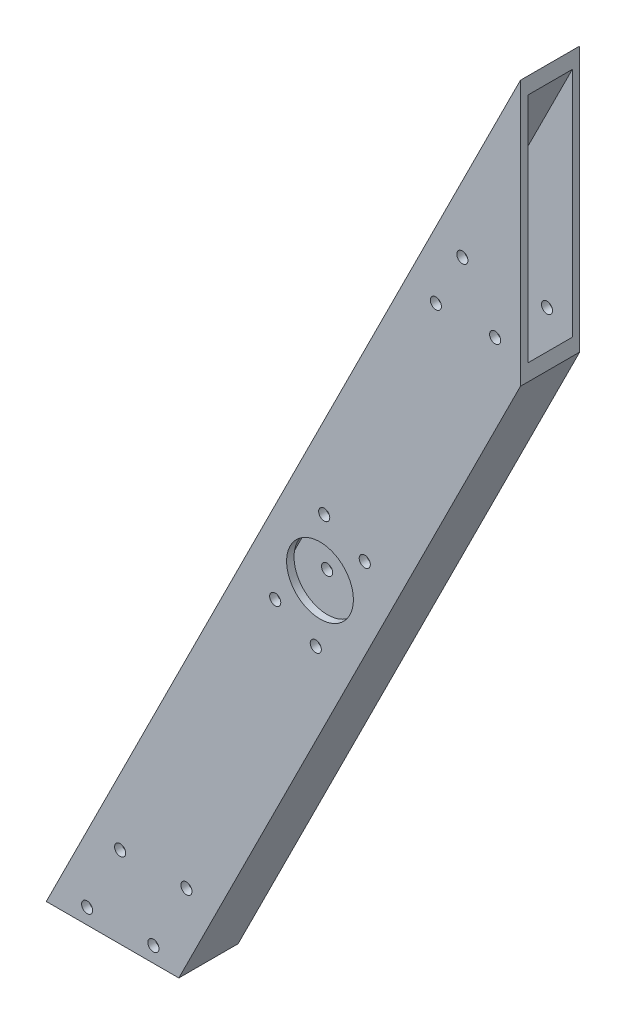
ISO-10303-21;
HEADER;
FILE_DESCRIPTION(('STEP AP214'),'2;1');
FILE_NAME('part.step','',(''),(''),'','','');
FILE_SCHEMA(('AUTOMOTIVE_DESIGN { 1 0 10303 214 1 1 1 1 }'));
ENDSEC;
DATA;
#1=APPLICATION_CONTEXT('core data for automotive mechanical design processes');
#2=APPLICATION_PROTOCOL_DEFINITION('international standard','automotive_design',2000,#1);
#3=PRODUCT_CONTEXT('',#1,'mechanical');
#4=PRODUCT('Part','Part','',(#3));
#5=PRODUCT_RELATED_PRODUCT_CATEGORY('part','',(#4));
#6=PRODUCT_DEFINITION_FORMATION('','',#4);
#7=PRODUCT_DEFINITION_CONTEXT('part definition',#1,'design');
#8=PRODUCT_DEFINITION('design','',#6,#7);
#9=PRODUCT_DEFINITION_SHAPE('','',#8);
#10=(LENGTH_UNIT() NAMED_UNIT(*) SI_UNIT(.MILLI.,.METRE.));
#11=(NAMED_UNIT(*) PLANE_ANGLE_UNIT() SI_UNIT($,.RADIAN.));
#12=(NAMED_UNIT(*) SI_UNIT($,.STERADIAN.) SOLID_ANGLE_UNIT());
#13=UNCERTAINTY_MEASURE_WITH_UNIT(LENGTH_MEASURE(1.E-05),#10,'distance_accuracy_value','');
#14=(GEOMETRIC_REPRESENTATION_CONTEXT(3) GLOBAL_UNCERTAINTY_ASSIGNED_CONTEXT((#13)) GLOBAL_UNIT_ASSIGNED_CONTEXT((#10,
#11,#12)) REPRESENTATION_CONTEXT('',''));
#15=CARTESIAN_POINT('',(0.,0.,0.));
#16=DIRECTION('',(0.,0.,1.));
#17=DIRECTION('',(1.,0.,0.));
#18=AXIS2_PLACEMENT_3D('',#15,#16,#17);
#19=CARTESIAN_POINT('',(56.7961266284947,0.,25.4));
#20=DIRECTION('',(0.,1.,0.));
#21=DIRECTION('',(-1.,0.,0.));
#22=AXIS2_PLACEMENT_3D('',#19,#20,#21);
#23=PLANE('',#22);
#24=DIRECTION('',(1.,0.,0.));
#25=VECTOR('',#24,1.);
#26=CARTESIAN_POINT('',(56.7961266284947,0.,0.));
#27=LINE('',#26,#25);
#28=CARTESIAN_POINT('',(0.,0.,0.));
#29=VERTEX_POINT('',#28);
#30=CARTESIAN_POINT('',(56.7961266284947,0.,0.));
#31=VERTEX_POINT('',#30);
#32=EDGE_CURVE('E133',#29,#31,#27,.T.);
#33=ORIENTED_EDGE('',*,*,#32,.T.);
#34=DIRECTION('',(0.,0.,-1.));
#35=VECTOR('',#34,1.);
#36=CARTESIAN_POINT('',(56.7961266284947,0.,25.4));
#37=LINE('',#36,#35);
#38=CARTESIAN_POINT('',(56.7961266284947,0.,25.4));
#39=VERTEX_POINT('',#38);
#40=EDGE_CURVE('E11',#39,#31,#37,.T.);
#41=ORIENTED_EDGE('',*,*,#40,.F.);
#42=DIRECTION('',(1.,0.,0.));
#43=VECTOR('',#42,1.);
#44=CARTESIAN_POINT('',(56.7961266284947,0.,25.4));
#45=LINE('',#44,#43);
#46=CARTESIAN_POINT('',(0.,0.,25.4));
#47=VERTEX_POINT('',#46);
#48=EDGE_CURVE('E139',#47,#39,#45,.T.);
#49=ORIENTED_EDGE('',*,*,#48,.F.);
#50=DIRECTION('',(0.,0.,-1.));
#51=VECTOR('',#50,1.);
#52=CARTESIAN_POINT('',(0.,0.,25.4));
#53=LINE('',#52,#51);
#54=EDGE_CURVE('E149',#47,#29,#53,.T.);
#55=ORIENTED_EDGE('',*,*,#54,.T.);
#56=EDGE_LOOP('',(#33,#41,#49,#55));
#57=FACE_BOUND('',#56,.T.);
#58=DIRECTION('',(1.,0.,0.));
#59=VECTOR('',#58,1.);
#60=CARTESIAN_POINT('',(56.7961266284947,0.,3.175));
#61=LINE('',#60,#59);
#62=CARTESIAN_POINT('',(3.54975791428092,0.,3.175));
#63=VERTEX_POINT('',#62);
#64=CARTESIAN_POINT('',(53.2463687142137,0.,3.175));
#65=VERTEX_POINT('',#64);
#66=EDGE_CURVE('E109',#63,#65,#61,.T.);
#67=ORIENTED_EDGE('',*,*,#66,.F.);
#68=DIRECTION('',(0.,0.,-1.));
#69=VECTOR('',#68,1.);
#70=CARTESIAN_POINT('',(3.54975791428092,0.,25.4));
#71=LINE('',#70,#69);
#72=CARTESIAN_POINT('',(3.54975791428092,0.,22.225));
#73=VERTEX_POINT('',#72);
#74=EDGE_CURVE('E129',#73,#63,#71,.T.);
#75=ORIENTED_EDGE('',*,*,#74,.F.);
#76=DIRECTION('',(1.,0.,0.));
#77=VECTOR('',#76,1.);
#78=CARTESIAN_POINT('',(56.7961266284947,0.,22.225));
#79=LINE('',#78,#77);
#80=CARTESIAN_POINT('',(53.2463687142137,0.,22.225));
#81=VERTEX_POINT('',#80);
#82=EDGE_CURVE('E53',#73,#81,#79,.T.);
#83=ORIENTED_EDGE('',*,*,#82,.T.);
#84=DIRECTION('',(0.,0.,-1.));
#85=VECTOR('',#84,1.);
#86=CARTESIAN_POINT('',(53.2463687142138,0.,25.4));
#87=LINE('',#86,#85);
#88=EDGE_CURVE('E119',#81,#65,#87,.T.);
#89=ORIENTED_EDGE('',*,*,#88,.T.);
#90=EDGE_LOOP('',(#67,#75,#83,#89));
#91=FACE_BOUND('',#90,.T.);
#92=ADVANCED_FACE('F37',(#57,#91),#23,.F.);
#93=CARTESIAN_POINT('',(203.2,406.4,25.4));
#94=DIRECTION('',(-1.,0.,0.));
#95=DIRECTION('',(0.,0.,1.));
#96=AXIS2_PLACEMENT_3D('',#93,#94,#95);
#97=PLANE('',#96);
#98=DIRECTION('',(0.,1.,0.));
#99=VECTOR('',#98,1.);
#100=CARTESIAN_POINT('',(203.2,406.4,0.));
#101=LINE('',#100,#99);
#102=CARTESIAN_POINT('',(203.2,292.807746743011,0.));
#103=VERTEX_POINT('',#102);
#104=CARTESIAN_POINT('',(203.2,406.4,0.));
#105=VERTEX_POINT('',#104);
#106=EDGE_CURVE('E154',#103,#105,#101,.T.);
#107=ORIENTED_EDGE('',*,*,#106,.T.);
#108=DIRECTION('',(0.,0.,-1.));
#109=VECTOR('',#108,1.);
#110=CARTESIAN_POINT('',(203.2,406.4,25.4));
#111=LINE('',#110,#109);
#112=CARTESIAN_POINT('',(203.2,406.4,25.4));
#113=VERTEX_POINT('',#112);
#114=EDGE_CURVE('E159',#113,#105,#111,.T.);
#115=ORIENTED_EDGE('',*,*,#114,.F.);
#116=DIRECTION('',(0.,1.,0.));
#117=VECTOR('',#116,1.);
#118=CARTESIAN_POINT('',(203.2,406.4,25.4));
#119=LINE('',#118,#117);
#120=CARTESIAN_POINT('',(203.2,292.807746743011,25.4));
#121=VERTEX_POINT('',#120);
#122=EDGE_CURVE('E145',#121,#113,#119,.T.);
#123=ORIENTED_EDGE('',*,*,#122,.F.);
#124=DIRECTION('',(0.,0.,-1.));
#125=VECTOR('',#124,1.);
#126=CARTESIAN_POINT('',(203.2,292.807746743011,25.4));
#127=LINE('',#126,#125);
#128=EDGE_CURVE('E45',#121,#103,#127,.T.);
#129=ORIENTED_EDGE('',*,*,#128,.T.);
#130=EDGE_LOOP('',(#107,#115,#123,#129));
#131=FACE_BOUND('',#130,.T.);
#132=DIRECTION('',(0.,1.,0.));
#133=VECTOR('',#132,1.);
#134=CARTESIAN_POINT('',(203.2,406.4,3.175));
#135=LINE('',#134,#133);
#136=CARTESIAN_POINT('',(203.2,299.907262571573,3.175));
#137=VERTEX_POINT('',#136);
#138=CARTESIAN_POINT('',(203.2,399.300484171438,3.175));
#139=VERTEX_POINT('',#138);
#140=EDGE_CURVE('E106',#137,#139,#135,.T.);
#141=ORIENTED_EDGE('',*,*,#140,.F.);
#142=DIRECTION('',(0.,0.,-1.));
#143=VECTOR('',#142,1.);
#144=CARTESIAN_POINT('',(203.2,299.907262571573,25.4));
#145=LINE('',#144,#143);
#146=CARTESIAN_POINT('',(203.2,299.907262571573,22.225));
#147=VERTEX_POINT('',#146);
#148=EDGE_CURVE('E115',#147,#137,#145,.T.);
#149=ORIENTED_EDGE('',*,*,#148,.F.);
#150=DIRECTION('',(0.,1.,0.));
#151=VECTOR('',#150,1.);
#152=CARTESIAN_POINT('',(203.2,406.4,22.225));
#153=LINE('',#152,#151);
#154=CARTESIAN_POINT('',(203.2,399.300484171438,22.225));
#155=VERTEX_POINT('',#154);
#156=EDGE_CURVE('E58',#147,#155,#153,.T.);
#157=ORIENTED_EDGE('',*,*,#156,.T.);
#158=DIRECTION('',(0.,0.,-1.));
#159=VECTOR('',#158,1.);
#160=CARTESIAN_POINT('',(203.2,399.300484171438,25.4));
#161=LINE('',#160,#159);
#162=EDGE_CURVE('E120',#155,#139,#161,.T.);
#163=ORIENTED_EDGE('',*,*,#162,.T.);
#164=EDGE_LOOP('',(#141,#149,#157,#163));
#165=FACE_BOUND('',#164,.T.);
#166=ADVANCED_FACE('F123',(#131,#165),#97,.F.);
#167=CARTESIAN_POINT('',(203.2,292.807746743011,25.4));
#168=DIRECTION('',(-0.894427190999916,0.447213595499958,0.));
#169=DIRECTION('',(-0.447213595499958,-0.894427190999916,0.));
#170=AXIS2_PLACEMENT_3D('',#167,#168,#169);
#171=PLANE('',#170);
#172=DIRECTION('',(0.447213595499958,0.894427190999916,0.));
#173=VECTOR('',#172,1.);
#174=CARTESIAN_POINT('',(203.2,292.807746743011,0.));
#175=LINE('',#174,#173);
#176=EDGE_CURVE('E152',#31,#103,#175,.T.);
#177=ORIENTED_EDGE('',*,*,#176,.T.);
#178=ORIENTED_EDGE('',*,*,#128,.F.);
#179=DIRECTION('',(0.447213595499958,0.894427190999916,0.));
#180=VECTOR('',#179,1.);
#181=CARTESIAN_POINT('',(203.2,292.807746743011,25.4));
#182=LINE('',#181,#180);
#183=EDGE_CURVE('E142',#39,#121,#182,.T.);
#184=ORIENTED_EDGE('',*,*,#183,.F.);
#185=ORIENTED_EDGE('',*,*,#40,.T.);
#186=EDGE_LOOP('',(#177,#178,#184,#185));
#187=FACE_BOUND('',#186,.T.);
#188=ADVANCED_FACE('F270',(#187),#171,.F.);
#189=CARTESIAN_POINT('',(0.,0.,25.4));
#190=DIRECTION('',(0.894427190999916,-0.447213595499958,0.));
#191=DIRECTION('',(0.447213595499958,0.894427190999916,0.));
#192=AXIS2_PLACEMENT_3D('',#189,#190,#191);
#193=PLANE('',#192);
#194=DIRECTION('',(-0.447213595499958,-0.894427190999916,0.));
#195=VECTOR('',#194,1.);
#196=CARTESIAN_POINT('',(0.,0.,0.));
#197=LINE('',#196,#195);
#198=EDGE_CURVE('E143',#105,#29,#197,.T.);
#199=ORIENTED_EDGE('',*,*,#198,.T.);
#200=ORIENTED_EDGE('',*,*,#54,.F.);
#201=DIRECTION('',(-0.447213595499958,-0.894427190999916,0.));
#202=VECTOR('',#201,1.);
#203=CARTESIAN_POINT('',(0.,0.,25.4));
#204=LINE('',#203,#202);
#205=EDGE_CURVE('E147',#113,#47,#204,.T.);
#206=ORIENTED_EDGE('',*,*,#205,.F.);
#207=ORIENTED_EDGE('',*,*,#114,.T.);
#208=EDGE_LOOP('',(#199,#200,#206,#207));
#209=FACE_BOUND('',#208,.T.);
#210=ADVANCED_FACE('F289',(#209),#193,.F.);
#211=CARTESIAN_POINT('',(0.,0.,25.4));
#212=DIRECTION('',(0.,0.,1.));
#213=DIRECTION('',(1.,0.,0.));
#214=AXIS2_PLACEMENT_3D('',#211,#212,#213);
#215=PLANE('',#214);
#216=CARTESIAN_POINT('',(17.5010316571237,6.604,25.4));
#217=DIRECTION('',(0.,0.,1.));
#218=DIRECTION('',(1.,0.,0.));
#219=AXIS2_PLACEMENT_3D('',#216,#217,#218);
#220=CIRCLE('',#219,2.38125);
#221=CARTESIAN_POINT('',(19.8822816571237,6.604,25.4));
#222=VERTEX_POINT('',#221);
#223=EDGE_CURVE('E386',#222,#222,#220,.T.);
#224=ORIENTED_EDGE('',*,*,#223,.F.);
#225=EDGE_LOOP('',(#224));
#226=FACE_BOUND('',#225,.T.);
#227=CARTESIAN_POINT('',(45.899094971371,6.604,25.4));
#228=DIRECTION('',(0.,0.,1.));
#229=DIRECTION('',(1.,0.,0.));
#230=AXIS2_PLACEMENT_3D('',#227,#228,#229);
#231=CIRCLE('',#230,2.38125);
#232=CARTESIAN_POINT('',(48.280344971371,6.604,25.4));
#233=VERTEX_POINT('',#232);
#234=EDGE_CURVE('E706',#233,#233,#231,.T.);
#235=ORIENTED_EDGE('',*,*,#234,.F.);
#236=EDGE_LOOP('',(#235));
#237=FACE_BOUND('',#236,.T.);
#238=CARTESIAN_POINT('',(31.6615316571236,34.925,25.4));
#239=DIRECTION('',(0.,0.,1.));
#240=DIRECTION('',(1.,0.,0.));
#241=AXIS2_PLACEMENT_3D('',#238,#239,#240);
#242=CIRCLE('',#241,2.38125);
#243=CARTESIAN_POINT('',(34.0427816571236,34.925,25.4));
#244=VERTEX_POINT('',#243);
#245=EDGE_CURVE('E700',#244,#244,#242,.T.);
#246=ORIENTED_EDGE('',*,*,#245,.F.);
#247=EDGE_LOOP('',(#246));
#248=FACE_BOUND('',#247,.T.);
#249=CARTESIAN_POINT('',(60.059594971371,34.925,25.4));
#250=DIRECTION('',(0.,0.,1.));
#251=DIRECTION('',(1.,0.,0.));
#252=AXIS2_PLACEMENT_3D('',#249,#250,#251);
#253=CIRCLE('',#252,2.38125);
#254=CARTESIAN_POINT('',(62.440844971371,34.925,25.4));
#255=VERTEX_POINT('',#254);
#256=EDGE_CURVE('E709',#255,#255,#253,.T.);
#257=ORIENTED_EDGE('',*,*,#256,.F.);
#258=EDGE_LOOP('',(#257));
#259=FACE_BOUND('',#258,.T.);
#260=CARTESIAN_POINT('',(166.949905286198,305.501747258149,25.4));
#261=DIRECTION('',(0.,0.,1.));
#262=DIRECTION('',(1.,0.,0.));
#263=AXIS2_PLACEMENT_3D('',#260,#261,#262);
#264=CIRCLE('',#263,2.38125000000001);
#265=CARTESIAN_POINT('',(169.331155286198,305.501747258149,25.4));
#266=VERTEX_POINT('',#265);
#267=EDGE_CURVE('E718',#266,#266,#264,.T.);
#268=ORIENTED_EDGE('',*,*,#267,.F.);
#269=EDGE_LOOP('',(#268));
#270=FACE_BOUND('',#269,.T.);
#271=CARTESIAN_POINT('',(178.309130611897,328.220197909546,25.4));
#272=DIRECTION('',(0.,0.,1.));
#273=DIRECTION('',(1.,0.,0.));
#274=AXIS2_PLACEMENT_3D('',#271,#272,#273);
#275=CIRCLE('',#274,2.38125000000001);
#276=CARTESIAN_POINT('',(180.690380611897,328.220197909546,25.4));
#277=VERTEX_POINT('',#276);
#278=EDGE_CURVE('E724',#277,#277,#275,.T.);
#279=ORIENTED_EDGE('',*,*,#278,.F.);
#280=EDGE_LOOP('',(#279));
#281=FACE_BOUND('',#280,.T.);
#282=CARTESIAN_POINT('',(192.349905286198,305.501747258149,25.4));
#283=DIRECTION('',(0.,0.,1.));
#284=DIRECTION('',(1.,0.,0.));
#285=AXIS2_PLACEMENT_3D('',#282,#283,#284);
#286=CIRCLE('',#285,2.38125000000001);
#287=CARTESIAN_POINT('',(194.731155286198,305.501747258149,25.4));
#288=VERTEX_POINT('',#287);
#289=EDGE_CURVE('E730',#288,#288,#286,.T.);
#290=ORIENTED_EDGE('',*,*,#289,.F.);
#291=EDGE_LOOP('',(#290));
#292=FACE_BOUND('',#291,.T.);
#293=CARTESIAN_POINT('',(119.098644424551,203.136098903841,25.4));
#294=DIRECTION('',(0.,0.,1.));
#295=DIRECTION('',(1.,0.,0.));
#296=AXIS2_PLACEMENT_3D('',#293,#294,#295);
#297=CIRCLE('',#296,2.38125000000002);
#298=CARTESIAN_POINT('',(121.479894424551,203.136098903841,25.4));
#299=VERTEX_POINT('',#298);
#300=EDGE_CURVE('E225',#299,#299,#297,.T.);
#301=ORIENTED_EDGE('',*,*,#300,.F.);
#302=EDGE_LOOP('',(#301));
#303=FACE_BOUND('',#302,.T.);
#304=CARTESIAN_POINT('',(136.486593771138,194.442124230547,25.4));
#305=DIRECTION('',(0.,0.,1.));
#306=DIRECTION('',(1.,0.,0.));
#307=AXIS2_PLACEMENT_3D('',#304,#305,#306);
#308=CIRCLE('',#307,2.38125);
#309=CARTESIAN_POINT('',(138.867843771138,194.442124230547,25.4));
#310=VERTEX_POINT('',#309);
#311=EDGE_CURVE('E231',#310,#310,#308,.T.);
#312=ORIENTED_EDGE('',*,*,#311,.F.);
#313=EDGE_LOOP('',(#312));
#314=FACE_BOUND('',#313,.T.);
#315=CARTESIAN_POINT('',(98.1095328573563,161.157875769453,25.4));
#316=DIRECTION('',(0.,0.,1.));
#317=DIRECTION('',(1.,0.,0.));
#318=AXIS2_PLACEMENT_3D('',#315,#316,#317);
#319=CIRCLE('',#318,2.38125);
#320=CARTESIAN_POINT('',(100.490782857356,161.157875769453,25.4));
#321=VERTEX_POINT('',#320);
#322=EDGE_CURVE('E237',#321,#321,#319,.T.);
#323=ORIENTED_EDGE('',*,*,#322,.F.);
#324=EDGE_LOOP('',(#323));
#325=FACE_BOUND('',#324,.T.);
#326=CARTESIAN_POINT('',(115.497482203944,152.463901096159,25.4));
#327=DIRECTION('',(0.,0.,1.));
#328=DIRECTION('',(1.,0.,0.));
#329=AXIS2_PLACEMENT_3D('',#326,#327,#328);
#330=CIRCLE('',#329,2.38125000000003);
#331=CARTESIAN_POINT('',(117.878732203944,152.463901096159,25.4));
#332=VERTEX_POINT('',#331);
#333=EDGE_CURVE('E222',#332,#332,#330,.T.);
#334=ORIENTED_EDGE('',*,*,#333,.F.);
#335=EDGE_LOOP('',(#334));
#336=FACE_BOUND('',#335,.T.);
#337=CARTESIAN_POINT('',(117.298063314247,177.8,25.4));
#338=DIRECTION('',(0.,0.,1.));
#339=DIRECTION('',(1.,0.,0.));
#340=AXIS2_PLACEMENT_3D('',#337,#338,#339);
#341=CIRCLE('',#340,14.3129);
#342=CARTESIAN_POINT('',(131.610963314247,177.8,25.4));
#343=VERTEX_POINT('',#342);
#344=EDGE_CURVE('E253',#343,#343,#341,.T.);
#345=ORIENTED_EDGE('',*,*,#344,.F.);
#346=EDGE_LOOP('',(#345));
#347=FACE_BOUND('',#346,.T.);
#348=ORIENTED_EDGE('',*,*,#48,.T.);
#349=ORIENTED_EDGE('',*,*,#183,.T.);
#350=ORIENTED_EDGE('',*,*,#122,.T.);
#351=ORIENTED_EDGE('',*,*,#205,.T.);
#352=EDGE_LOOP('',(#348,#349,#350,#351));
#353=FACE_BOUND('',#352,.T.);
#354=ADVANCED_FACE('F285',(#226,#237,#248,#259,#270,#281,#292,#303,#314,#325,#336,#347,#353),
#215,.T.);
#355=CARTESIAN_POINT('',(0.,0.,0.));
#356=DIRECTION('',(0.,0.,1.));
#357=DIRECTION('',(1.,0.,0.));
#358=AXIS2_PLACEMENT_3D('',#355,#356,#357);
#359=PLANE('',#358);
#360=CARTESIAN_POINT('',(17.5010316571237,6.604,0.));
#361=DIRECTION('',(0.,0.,1.));
#362=DIRECTION('',(1.,0.,0.));
#363=AXIS2_PLACEMENT_3D('',#360,#361,#362);
#364=CIRCLE('',#363,2.38125);
#365=CARTESIAN_POINT('',(19.8822816571237,6.604,0.));
#366=VERTEX_POINT('',#365);
#367=EDGE_CURVE('E189',#366,#366,#364,.T.);
#368=ORIENTED_EDGE('',*,*,#367,.T.);
#369=EDGE_LOOP('',(#368));
#370=FACE_BOUND('',#369,.T.);
#371=CARTESIAN_POINT('',(45.899094971371,6.604,0.));
#372=DIRECTION('',(0.,0.,1.));
#373=DIRECTION('',(1.,0.,0.));
#374=AXIS2_PLACEMENT_3D('',#371,#372,#373);
#375=CIRCLE('',#374,2.38125);
#376=CARTESIAN_POINT('',(48.280344971371,6.604,0.));
#377=VERTEX_POINT('',#376);
#378=EDGE_CURVE('E702',#377,#377,#375,.T.);
#379=ORIENTED_EDGE('',*,*,#378,.T.);
#380=EDGE_LOOP('',(#379));
#381=FACE_BOUND('',#380,.T.);
#382=CARTESIAN_POINT('',(31.6615316571236,34.925,0.));
#383=DIRECTION('',(0.,0.,1.));
#384=DIRECTION('',(1.,0.,0.));
#385=AXIS2_PLACEMENT_3D('',#382,#383,#384);
#386=CIRCLE('',#385,2.38125);
#387=CARTESIAN_POINT('',(34.0427816571236,34.925,0.));
#388=VERTEX_POINT('',#387);
#389=EDGE_CURVE('E703',#388,#388,#386,.T.);
#390=ORIENTED_EDGE('',*,*,#389,.T.);
#391=EDGE_LOOP('',(#390));
#392=FACE_BOUND('',#391,.T.);
#393=CARTESIAN_POINT('',(60.059594971371,34.925,0.));
#394=DIRECTION('',(0.,0.,1.));
#395=DIRECTION('',(1.,0.,0.));
#396=AXIS2_PLACEMENT_3D('',#393,#394,#395);
#397=CIRCLE('',#396,2.38125);
#398=CARTESIAN_POINT('',(62.440844971371,34.925,0.));
#399=VERTEX_POINT('',#398);
#400=EDGE_CURVE('E715',#399,#399,#397,.T.);
#401=ORIENTED_EDGE('',*,*,#400,.T.);
#402=EDGE_LOOP('',(#401));
#403=FACE_BOUND('',#402,.T.);
#404=CARTESIAN_POINT('',(166.949905286198,305.501747258149,0.));
#405=DIRECTION('',(0.,0.,1.));
#406=DIRECTION('',(1.,0.,0.));
#407=AXIS2_PLACEMENT_3D('',#404,#405,#406);
#408=CIRCLE('',#407,2.38125000000001);
#409=CARTESIAN_POINT('',(169.331155286198,305.501747258149,0.));
#410=VERTEX_POINT('',#409);
#411=EDGE_CURVE('E721',#410,#410,#408,.T.);
#412=ORIENTED_EDGE('',*,*,#411,.T.);
#413=EDGE_LOOP('',(#412));
#414=FACE_BOUND('',#413,.T.);
#415=CARTESIAN_POINT('',(178.309130611897,328.220197909546,0.));
#416=DIRECTION('',(0.,0.,1.));
#417=DIRECTION('',(1.,0.,0.));
#418=AXIS2_PLACEMENT_3D('',#415,#416,#417);
#419=CIRCLE('',#418,2.38125000000001);
#420=CARTESIAN_POINT('',(180.690380611897,328.220197909546,0.));
#421=VERTEX_POINT('',#420);
#422=EDGE_CURVE('E727',#421,#421,#419,.T.);
#423=ORIENTED_EDGE('',*,*,#422,.T.);
#424=EDGE_LOOP('',(#423));
#425=FACE_BOUND('',#424,.T.);
#426=CARTESIAN_POINT('',(192.349905286198,305.501747258149,0.));
#427=DIRECTION('',(0.,0.,1.));
#428=DIRECTION('',(1.,0.,0.));
#429=AXIS2_PLACEMENT_3D('',#426,#427,#428);
#430=CIRCLE('',#429,2.38125000000001);
#431=CARTESIAN_POINT('',(194.731155286198,305.501747258149,0.));
#432=VERTEX_POINT('',#431);
#433=EDGE_CURVE('E733',#432,#432,#430,.T.);
#434=ORIENTED_EDGE('',*,*,#433,.T.);
#435=EDGE_LOOP('',(#434));
#436=FACE_BOUND('',#435,.T.);
#437=CARTESIAN_POINT('',(119.098644424551,203.136098903841,0.));
#438=DIRECTION('',(0.,0.,1.));
#439=DIRECTION('',(1.,0.,0.));
#440=AXIS2_PLACEMENT_3D('',#437,#438,#439);
#441=CIRCLE('',#440,2.38125000000002);
#442=CARTESIAN_POINT('',(121.479894424551,203.136098903841,0.));
#443=VERTEX_POINT('',#442);
#444=EDGE_CURVE('E172',#443,#443,#441,.T.);
#445=ORIENTED_EDGE('',*,*,#444,.T.);
#446=EDGE_LOOP('',(#445));
#447=FACE_BOUND('',#446,.T.);
#448=CARTESIAN_POINT('',(136.486593771138,194.442124230547,0.));
#449=DIRECTION('',(0.,0.,1.));
#450=DIRECTION('',(1.,0.,0.));
#451=AXIS2_PLACEMENT_3D('',#448,#449,#450);
#452=CIRCLE('',#451,2.38125);
#453=CARTESIAN_POINT('',(138.867843771138,194.442124230547,0.));
#454=VERTEX_POINT('',#453);
#455=EDGE_CURVE('E228',#454,#454,#452,.T.);
#456=ORIENTED_EDGE('',*,*,#455,.T.);
#457=EDGE_LOOP('',(#456));
#458=FACE_BOUND('',#457,.T.);
#459=CARTESIAN_POINT('',(98.1095328573563,161.157875769453,0.));
#460=DIRECTION('',(0.,0.,1.));
#461=DIRECTION('',(1.,0.,0.));
#462=AXIS2_PLACEMENT_3D('',#459,#460,#461);
#463=CIRCLE('',#462,2.38125);
#464=CARTESIAN_POINT('',(100.490782857356,161.157875769453,0.));
#465=VERTEX_POINT('',#464);
#466=EDGE_CURVE('E234',#465,#465,#463,.T.);
#467=ORIENTED_EDGE('',*,*,#466,.T.);
#468=EDGE_LOOP('',(#467));
#469=FACE_BOUND('',#468,.T.);
#470=CARTESIAN_POINT('',(115.497482203944,152.463901096159,0.));
#471=DIRECTION('',(0.,0.,1.));
#472=DIRECTION('',(1.,0.,0.));
#473=AXIS2_PLACEMENT_3D('',#470,#471,#472);
#474=CIRCLE('',#473,2.38125000000003);
#475=CARTESIAN_POINT('',(117.878732203944,152.463901096159,0.));
#476=VERTEX_POINT('',#475);
#477=EDGE_CURVE('E240',#476,#476,#474,.T.);
#478=ORIENTED_EDGE('',*,*,#477,.T.);
#479=EDGE_LOOP('',(#478));
#480=FACE_BOUND('',#479,.T.);
#481=CARTESIAN_POINT('',(117.298063314247,177.8,0.));
#482=DIRECTION('',(0.,0.,1.));
#483=DIRECTION('',(1.,0.,0.));
#484=AXIS2_PLACEMENT_3D('',#481,#482,#483);
#485=CIRCLE('',#484,14.3129);
#486=CARTESIAN_POINT('',(131.610963314247,177.8,0.));
#487=VERTEX_POINT('',#486);
#488=EDGE_CURVE('E167',#487,#487,#485,.T.);
#489=ORIENTED_EDGE('',*,*,#488,.T.);
#490=EDGE_LOOP('',(#489));
#491=FACE_BOUND('',#490,.T.);
#492=ORIENTED_EDGE('',*,*,#32,.F.);
#493=ORIENTED_EDGE('',*,*,#198,.F.);
#494=ORIENTED_EDGE('',*,*,#106,.F.);
#495=ORIENTED_EDGE('',*,*,#176,.F.);
#496=EDGE_LOOP('',(#492,#493,#494,#495));
#497=FACE_BOUND('',#496,.T.);
#498=ADVANCED_FACE('F279',(#370,#381,#392,#403,#414,#425,#436,#447,#458,#469,#480,#491,#497),
#359,.F.);
#499=CARTESIAN_POINT('',(200.360193668575,294.227649908723,25.4));
#500=DIRECTION('',(-0.894427190999916,0.447213595499958,0.));
#501=DIRECTION('',(-0.447213595499958,-0.894427190999916,0.));
#502=AXIS2_PLACEMENT_3D('',#499,#500,#501);
#503=PLANE('',#502);
#504=DIRECTION('',(0.447213595499958,0.894427190999916,0.));
#505=VECTOR('',#504,1.);
#506=CARTESIAN_POINT('',(200.360193668575,294.227649908723,3.175));
#507=LINE('',#506,#505);
#508=EDGE_CURVE('E102',#65,#137,#507,.T.);
#509=ORIENTED_EDGE('',*,*,#508,.F.);
#510=ORIENTED_EDGE('',*,*,#88,.F.);
#511=DIRECTION('',(0.447213595499958,0.894427190999916,0.));
#512=VECTOR('',#511,1.);
#513=CARTESIAN_POINT('',(200.360193668575,294.227649908723,22.225));
#514=LINE('',#513,#512);
#515=EDGE_CURVE('E117',#81,#147,#514,.T.);
#516=ORIENTED_EDGE('',*,*,#515,.T.);
#517=ORIENTED_EDGE('',*,*,#148,.T.);
#518=EDGE_LOOP('',(#509,#510,#516,#517));
#519=FACE_BOUND('',#518,.T.);
#520=ADVANCED_FACE('F116',(#519),#503,.T.);
#521=CARTESIAN_POINT('',(2.83980633142473,-1.41990316571237,25.4));
#522=DIRECTION('',(0.894427190999916,-0.447213595499958,0.));
#523=DIRECTION('',(0.447213595499958,0.894427190999916,0.));
#524=AXIS2_PLACEMENT_3D('',#521,#522,#523);
#525=PLANE('',#524);
#526=DIRECTION('',(-0.447213595499958,-0.894427190999916,0.));
#527=VECTOR('',#526,1.);
#528=CARTESIAN_POINT('',(2.83980633142473,-1.41990316571237,3.175));
#529=LINE('',#528,#527);
#530=EDGE_CURVE('E124',#139,#63,#529,.T.);
#531=ORIENTED_EDGE('',*,*,#530,.F.);
#532=ORIENTED_EDGE('',*,*,#162,.F.);
#533=DIRECTION('',(-0.447213595499958,-0.894427190999916,0.));
#534=VECTOR('',#533,1.);
#535=CARTESIAN_POINT('',(2.83980633142473,-1.41990316571237,22.225));
#536=LINE('',#535,#534);
#537=EDGE_CURVE('E131',#155,#73,#536,.T.);
#538=ORIENTED_EDGE('',*,*,#537,.T.);
#539=ORIENTED_EDGE('',*,*,#74,.T.);
#540=EDGE_LOOP('',(#531,#532,#538,#539));
#541=FACE_BOUND('',#540,.T.);
#542=ADVANCED_FACE('F263',(#541),#525,.T.);
#543=CARTESIAN_POINT('',(0.,0.,22.225));
#544=DIRECTION('',(0.,0.,1.));
#545=DIRECTION('',(1.,0.,0.));
#546=AXIS2_PLACEMENT_3D('',#543,#544,#545);
#547=PLANE('',#546);
#548=CARTESIAN_POINT('',(17.5010316571237,6.604,22.225));
#549=DIRECTION('',(0.,0.,1.));
#550=DIRECTION('',(1.,0.,0.));
#551=AXIS2_PLACEMENT_3D('',#548,#549,#550);
#552=CIRCLE('',#551,2.38125);
#553=CARTESIAN_POINT('',(19.8822816571237,6.604,22.225));
#554=VERTEX_POINT('',#553);
#555=EDGE_CURVE('E219',#554,#554,#552,.T.);
#556=ORIENTED_EDGE('',*,*,#555,.T.);
#557=EDGE_LOOP('',(#556));
#558=FACE_BOUND('',#557,.T.);
#559=CARTESIAN_POINT('',(45.899094971371,6.604,22.225));
#560=DIRECTION('',(0.,0.,1.));
#561=DIRECTION('',(1.,0.,0.));
#562=AXIS2_PLACEMENT_3D('',#559,#560,#561);
#563=CIRCLE('',#562,2.38125);
#564=CARTESIAN_POINT('',(48.280344971371,6.604,22.225));
#565=VERTEX_POINT('',#564);
#566=EDGE_CURVE('E207',#565,#565,#563,.T.);
#567=ORIENTED_EDGE('',*,*,#566,.T.);
#568=EDGE_LOOP('',(#567));
#569=FACE_BOUND('',#568,.T.);
#570=CARTESIAN_POINT('',(31.6615316571236,34.925,22.225));
#571=DIRECTION('',(0.,0.,1.));
#572=DIRECTION('',(1.,0.,0.));
#573=AXIS2_PLACEMENT_3D('',#570,#571,#572);
#574=CIRCLE('',#573,2.38125);
#575=CARTESIAN_POINT('',(34.0427816571236,34.925,22.225));
#576=VERTEX_POINT('',#575);
#577=EDGE_CURVE('E204',#576,#576,#574,.T.);
#578=ORIENTED_EDGE('',*,*,#577,.T.);
#579=EDGE_LOOP('',(#578));
#580=FACE_BOUND('',#579,.T.);
#581=CARTESIAN_POINT('',(60.059594971371,34.925,22.225));
#582=DIRECTION('',(0.,0.,1.));
#583=DIRECTION('',(1.,0.,0.));
#584=AXIS2_PLACEMENT_3D('',#581,#582,#583);
#585=CIRCLE('',#584,2.38125);
#586=CARTESIAN_POINT('',(62.440844971371,34.925,22.225));
#587=VERTEX_POINT('',#586);
#588=EDGE_CURVE('E201',#587,#587,#585,.T.);
#589=ORIENTED_EDGE('',*,*,#588,.T.);
#590=EDGE_LOOP('',(#589));
#591=FACE_BOUND('',#590,.T.);
#592=CARTESIAN_POINT('',(166.949905286198,305.501747258149,22.225));
#593=DIRECTION('',(0.,0.,1.));
#594=DIRECTION('',(1.,0.,0.));
#595=AXIS2_PLACEMENT_3D('',#592,#593,#594);
#596=CIRCLE('',#595,2.38125000000001);
#597=CARTESIAN_POINT('',(169.331155286198,305.501747258149,22.225));
#598=VERTEX_POINT('',#597);
#599=EDGE_CURVE('E197',#598,#598,#596,.T.);
#600=ORIENTED_EDGE('',*,*,#599,.T.);
#601=EDGE_LOOP('',(#600));
#602=FACE_BOUND('',#601,.T.);
#603=CARTESIAN_POINT('',(178.309130611897,328.220197909546,22.225));
#604=DIRECTION('',(0.,0.,1.));
#605=DIRECTION('',(1.,0.,0.));
#606=AXIS2_PLACEMENT_3D('',#603,#604,#605);
#607=CIRCLE('',#606,2.38125000000001);
#608=CARTESIAN_POINT('',(180.690380611897,328.220197909546,22.225));
#609=VERTEX_POINT('',#608);
#610=EDGE_CURVE('E193',#609,#609,#607,.T.);
#611=ORIENTED_EDGE('',*,*,#610,.T.);
#612=EDGE_LOOP('',(#611));
#613=FACE_BOUND('',#612,.T.);
#614=CARTESIAN_POINT('',(192.349905286198,305.501747258149,22.225));
#615=DIRECTION('',(0.,0.,1.));
#616=DIRECTION('',(1.,0.,0.));
#617=AXIS2_PLACEMENT_3D('',#614,#615,#616);
#618=CIRCLE('',#617,2.38125000000001);
#619=CARTESIAN_POINT('',(194.731155286198,305.501747258149,22.225));
#620=VERTEX_POINT('',#619);
#621=EDGE_CURVE('E188',#620,#620,#618,.T.);
#622=ORIENTED_EDGE('',*,*,#621,.T.);
#623=EDGE_LOOP('',(#622));
#624=FACE_BOUND('',#623,.T.);
#625=CARTESIAN_POINT('',(119.098644424551,203.136098903841,22.225));
#626=DIRECTION('',(0.,0.,1.));
#627=DIRECTION('',(1.,0.,0.));
#628=AXIS2_PLACEMENT_3D('',#625,#626,#627);
#629=CIRCLE('',#628,2.38125000000002);
#630=CARTESIAN_POINT('',(121.479894424551,203.136098903841,22.225));
#631=VERTEX_POINT('',#630);
#632=EDGE_CURVE('E184',#631,#631,#629,.T.);
#633=ORIENTED_EDGE('',*,*,#632,.T.);
#634=EDGE_LOOP('',(#633));
#635=FACE_BOUND('',#634,.T.);
#636=CARTESIAN_POINT('',(136.486593771138,194.442124230547,22.225));
#637=DIRECTION('',(0.,0.,1.));
#638=DIRECTION('',(1.,0.,0.));
#639=AXIS2_PLACEMENT_3D('',#636,#637,#638);
#640=CIRCLE('',#639,2.38125);
#641=CARTESIAN_POINT('',(138.867843771138,194.442124230547,22.225));
#642=VERTEX_POINT('',#641);
#643=EDGE_CURVE('E180',#642,#642,#640,.T.);
#644=ORIENTED_EDGE('',*,*,#643,.T.);
#645=EDGE_LOOP('',(#644));
#646=FACE_BOUND('',#645,.T.);
#647=CARTESIAN_POINT('',(98.1095328573563,161.157875769453,22.225));
#648=DIRECTION('',(0.,0.,1.));
#649=DIRECTION('',(1.,0.,0.));
#650=AXIS2_PLACEMENT_3D('',#647,#648,#649);
#651=CIRCLE('',#650,2.38125);
#652=CARTESIAN_POINT('',(100.490782857356,161.157875769453,22.225));
#653=VERTEX_POINT('',#652);
#654=EDGE_CURVE('E176',#653,#653,#651,.T.);
#655=ORIENTED_EDGE('',*,*,#654,.T.);
#656=EDGE_LOOP('',(#655));
#657=FACE_BOUND('',#656,.T.);
#658=CARTESIAN_POINT('',(115.497482203944,152.463901096159,22.225));
#659=DIRECTION('',(0.,0.,1.));
#660=DIRECTION('',(1.,0.,0.));
#661=AXIS2_PLACEMENT_3D('',#658,#659,#660);
#662=CIRCLE('',#661,2.38125000000003);
#663=CARTESIAN_POINT('',(117.878732203944,152.463901096159,22.225));
#664=VERTEX_POINT('',#663);
#665=EDGE_CURVE('E171',#664,#664,#662,.T.);
#666=ORIENTED_EDGE('',*,*,#665,.T.);
#667=EDGE_LOOP('',(#666));
#668=FACE_BOUND('',#667,.T.);
#669=CARTESIAN_POINT('',(117.298063314247,177.8,22.225));
#670=DIRECTION('',(0.,0.,1.));
#671=DIRECTION('',(1.,0.,0.));
#672=AXIS2_PLACEMENT_3D('',#669,#670,#671);
#673=CIRCLE('',#672,14.3129);
#674=CARTESIAN_POINT('',(131.610963314247,177.8,22.225));
#675=VERTEX_POINT('',#674);
#676=EDGE_CURVE('E138',#675,#675,#673,.T.);
#677=ORIENTED_EDGE('',*,*,#676,.T.);
#678=EDGE_LOOP('',(#677));
#679=FACE_BOUND('',#678,.T.);
#680=ORIENTED_EDGE('',*,*,#82,.F.);
#681=ORIENTED_EDGE('',*,*,#537,.F.);
#682=ORIENTED_EDGE('',*,*,#156,.F.);
#683=ORIENTED_EDGE('',*,*,#515,.F.);
#684=EDGE_LOOP('',(#680,#681,#682,#683));
#685=FACE_BOUND('',#684,.T.);
#686=ADVANCED_FACE('F305',(#558,#569,#580,#591,#602,#613,#624,#635,#646,#657,#668,#679,#685),
#547,.F.);
#687=CARTESIAN_POINT('',(0.,0.,3.175));
#688=DIRECTION('',(0.,0.,1.));
#689=DIRECTION('',(1.,0.,0.));
#690=AXIS2_PLACEMENT_3D('',#687,#688,#689);
#691=PLANE('',#690);
#692=CARTESIAN_POINT('',(17.5010316571237,6.604,3.175));
#693=DIRECTION('',(0.,0.,1.));
#694=DIRECTION('',(1.,0.,0.));
#695=AXIS2_PLACEMENT_3D('',#692,#693,#694);
#696=CIRCLE('',#695,2.38125);
#697=CARTESIAN_POINT('',(19.8822816571237,6.604,3.175));
#698=VERTEX_POINT('',#697);
#699=EDGE_CURVE('E40',#698,#698,#696,.T.);
#700=ORIENTED_EDGE('',*,*,#699,.F.);
#701=EDGE_LOOP('',(#700));
#702=FACE_BOUND('',#701,.T.);
#703=CARTESIAN_POINT('',(45.899094971371,6.604,3.175));
#704=DIRECTION('',(0.,0.,1.));
#705=DIRECTION('',(1.,0.,0.));
#706=AXIS2_PLACEMENT_3D('',#703,#704,#705);
#707=CIRCLE('',#706,2.38125);
#708=CARTESIAN_POINT('',(48.280344971371,6.604,3.175));
#709=VERTEX_POINT('',#708);
#710=EDGE_CURVE('E205',#709,#709,#707,.T.);
#711=ORIENTED_EDGE('',*,*,#710,.F.);
#712=EDGE_LOOP('',(#711));
#713=FACE_BOUND('',#712,.T.);
#714=CARTESIAN_POINT('',(31.6615316571236,34.925,3.175));
#715=DIRECTION('',(0.,0.,1.));
#716=DIRECTION('',(1.,0.,0.));
#717=AXIS2_PLACEMENT_3D('',#714,#715,#716);
#718=CIRCLE('',#717,2.38125);
#719=CARTESIAN_POINT('',(34.0427816571236,34.925,3.175));
#720=VERTEX_POINT('',#719);
#721=EDGE_CURVE('E202',#720,#720,#718,.T.);
#722=ORIENTED_EDGE('',*,*,#721,.F.);
#723=EDGE_LOOP('',(#722));
#724=FACE_BOUND('',#723,.T.);
#725=CARTESIAN_POINT('',(60.059594971371,34.925,3.175));
#726=DIRECTION('',(0.,0.,1.));
#727=DIRECTION('',(1.,0.,0.));
#728=AXIS2_PLACEMENT_3D('',#725,#726,#727);
#729=CIRCLE('',#728,2.38125);
#730=CARTESIAN_POINT('',(62.440844971371,34.925,3.175));
#731=VERTEX_POINT('',#730);
#732=EDGE_CURVE('E198',#731,#731,#729,.T.);
#733=ORIENTED_EDGE('',*,*,#732,.F.);
#734=EDGE_LOOP('',(#733));
#735=FACE_BOUND('',#734,.T.);
#736=CARTESIAN_POINT('',(166.949905286198,305.501747258149,3.175));
#737=DIRECTION('',(0.,0.,1.));
#738=DIRECTION('',(1.,0.,0.));
#739=AXIS2_PLACEMENT_3D('',#736,#737,#738);
#740=CIRCLE('',#739,2.38125000000001);
#741=CARTESIAN_POINT('',(169.331155286198,305.501747258149,3.175));
#742=VERTEX_POINT('',#741);
#743=EDGE_CURVE('E194',#742,#742,#740,.T.);
#744=ORIENTED_EDGE('',*,*,#743,.F.);
#745=EDGE_LOOP('',(#744));
#746=FACE_BOUND('',#745,.T.);
#747=CARTESIAN_POINT('',(178.309130611897,328.220197909546,3.175));
#748=DIRECTION('',(0.,0.,1.));
#749=DIRECTION('',(1.,0.,0.));
#750=AXIS2_PLACEMENT_3D('',#747,#748,#749);
#751=CIRCLE('',#750,2.38125000000001);
#752=CARTESIAN_POINT('',(180.690380611897,328.220197909546,3.175));
#753=VERTEX_POINT('',#752);
#754=EDGE_CURVE('E190',#753,#753,#751,.T.);
#755=ORIENTED_EDGE('',*,*,#754,.F.);
#756=EDGE_LOOP('',(#755));
#757=FACE_BOUND('',#756,.T.);
#758=CARTESIAN_POINT('',(192.349905286198,305.501747258149,3.175));
#759=DIRECTION('',(0.,0.,1.));
#760=DIRECTION('',(1.,0.,0.));
#761=AXIS2_PLACEMENT_3D('',#758,#759,#760);
#762=CIRCLE('',#761,2.38125000000001);
#763=CARTESIAN_POINT('',(194.731155286198,305.501747258149,3.175));
#764=VERTEX_POINT('',#763);
#765=EDGE_CURVE('E185',#764,#764,#762,.T.);
#766=ORIENTED_EDGE('',*,*,#765,.F.);
#767=EDGE_LOOP('',(#766));
#768=FACE_BOUND('',#767,.T.);
#769=CARTESIAN_POINT('',(119.098644424551,203.136098903841,3.175));
#770=DIRECTION('',(0.,0.,1.));
#771=DIRECTION('',(1.,0.,0.));
#772=AXIS2_PLACEMENT_3D('',#769,#770,#771);
#773=CIRCLE('',#772,2.38125000000002);
#774=CARTESIAN_POINT('',(121.479894424551,203.136098903841,3.175));
#775=VERTEX_POINT('',#774);
#776=EDGE_CURVE('E181',#775,#775,#773,.T.);
#777=ORIENTED_EDGE('',*,*,#776,.F.);
#778=EDGE_LOOP('',(#777));
#779=FACE_BOUND('',#778,.T.);
#780=CARTESIAN_POINT('',(136.486593771138,194.442124230547,3.175));
#781=DIRECTION('',(0.,0.,1.));
#782=DIRECTION('',(1.,0.,0.));
#783=AXIS2_PLACEMENT_3D('',#780,#781,#782);
#784=CIRCLE('',#783,2.38125);
#785=CARTESIAN_POINT('',(138.867843771138,194.442124230547,3.175));
#786=VERTEX_POINT('',#785);
#787=EDGE_CURVE('E177',#786,#786,#784,.T.);
#788=ORIENTED_EDGE('',*,*,#787,.F.);
#789=EDGE_LOOP('',(#788));
#790=FACE_BOUND('',#789,.T.);
#791=CARTESIAN_POINT('',(98.1095328573563,161.157875769453,3.175));
#792=DIRECTION('',(0.,0.,1.));
#793=DIRECTION('',(1.,0.,0.));
#794=AXIS2_PLACEMENT_3D('',#791,#792,#793);
#795=CIRCLE('',#794,2.38125);
#796=CARTESIAN_POINT('',(100.490782857356,161.157875769453,3.175));
#797=VERTEX_POINT('',#796);
#798=EDGE_CURVE('E173',#797,#797,#795,.T.);
#799=ORIENTED_EDGE('',*,*,#798,.F.);
#800=EDGE_LOOP('',(#799));
#801=FACE_BOUND('',#800,.T.);
#802=CARTESIAN_POINT('',(115.497482203944,152.463901096159,3.175));
#803=DIRECTION('',(0.,0.,1.));
#804=DIRECTION('',(1.,0.,0.));
#805=AXIS2_PLACEMENT_3D('',#802,#803,#804);
#806=CIRCLE('',#805,2.38125000000003);
#807=CARTESIAN_POINT('',(117.878732203944,152.463901096159,3.175));
#808=VERTEX_POINT('',#807);
#809=EDGE_CURVE('E168',#808,#808,#806,.T.);
#810=ORIENTED_EDGE('',*,*,#809,.F.);
#811=EDGE_LOOP('',(#810));
#812=FACE_BOUND('',#811,.T.);
#813=CARTESIAN_POINT('',(117.298063314247,177.8,3.175));
#814=DIRECTION('',(0.,0.,1.));
#815=DIRECTION('',(1.,0.,0.));
#816=AXIS2_PLACEMENT_3D('',#813,#814,#815);
#817=CIRCLE('',#816,14.3129);
#818=CARTESIAN_POINT('',(131.610963314247,177.8,3.175));
#819=VERTEX_POINT('',#818);
#820=EDGE_CURVE('E164',#819,#819,#817,.T.);
#821=ORIENTED_EDGE('',*,*,#820,.F.);
#822=EDGE_LOOP('',(#821));
#823=FACE_BOUND('',#822,.T.);
#824=ORIENTED_EDGE('',*,*,#66,.T.);
#825=ORIENTED_EDGE('',*,*,#508,.T.);
#826=ORIENTED_EDGE('',*,*,#140,.T.);
#827=ORIENTED_EDGE('',*,*,#530,.T.);
#828=EDGE_LOOP('',(#824,#825,#826,#827));
#829=FACE_BOUND('',#828,.T.);
#830=ADVANCED_FACE('F104',(#702,#713,#724,#735,#746,#757,#768,#779,#790,#801,#812,#823,#829),
#691,.T.);
#831=CARTESIAN_POINT('',(117.298063314247,177.8,0.));
#832=DIRECTION('',(0.,0.,1.));
#833=DIRECTION('',(1.,0.,0.));
#834=AXIS2_PLACEMENT_3D('',#831,#832,#833);
#835=CYLINDRICAL_SURFACE('',#834,14.3129);
#836=ORIENTED_EDGE('',*,*,#820,.T.);
#837=EDGE_LOOP('',(#836));
#838=FACE_BOUND('',#837,.T.);
#839=ORIENTED_EDGE('',*,*,#488,.F.);
#840=EDGE_LOOP('',(#839));
#841=FACE_BOUND('',#840,.T.);
#842=ADVANCED_FACE('F304',(#838,#841),#835,.F.);
#843=ORIENTED_EDGE('',*,*,#344,.T.);
#844=EDGE_LOOP('',(#843));
#845=FACE_BOUND('',#844,.T.);
#846=ORIENTED_EDGE('',*,*,#676,.F.);
#847=EDGE_LOOP('',(#846));
#848=FACE_BOUND('',#847,.T.);
#849=ADVANCED_FACE('F316',(#845,#848),#835,.F.);
#850=CARTESIAN_POINT('',(115.497482203944,152.463901096159,0.));
#851=DIRECTION('',(0.,0.,1.));
#852=DIRECTION('',(1.,0.,0.));
#853=AXIS2_PLACEMENT_3D('',#850,#851,#852);
#854=CYLINDRICAL_SURFACE('',#853,2.38125000000003);
#855=ORIENTED_EDGE('',*,*,#809,.T.);
#856=EDGE_LOOP('',(#855));
#857=FACE_BOUND('',#856,.T.);
#858=ORIENTED_EDGE('',*,*,#477,.F.);
#859=EDGE_LOOP('',(#858));
#860=FACE_BOUND('',#859,.T.);
#861=ADVANCED_FACE('F318',(#857,#860),#854,.F.);
#862=CARTESIAN_POINT('',(98.1095328573563,161.157875769453,0.));
#863=DIRECTION('',(0.,0.,1.));
#864=DIRECTION('',(1.,0.,0.));
#865=AXIS2_PLACEMENT_3D('',#862,#863,#864);
#866=CYLINDRICAL_SURFACE('',#865,2.38125);
#867=ORIENTED_EDGE('',*,*,#798,.T.);
#868=EDGE_LOOP('',(#867));
#869=FACE_BOUND('',#868,.T.);
#870=ORIENTED_EDGE('',*,*,#466,.F.);
#871=EDGE_LOOP('',(#870));
#872=FACE_BOUND('',#871,.T.);
#873=ADVANCED_FACE('F321',(#869,#872),#866,.F.);
#874=CARTESIAN_POINT('',(136.486593771138,194.442124230547,0.));
#875=DIRECTION('',(0.,0.,1.));
#876=DIRECTION('',(1.,0.,0.));
#877=AXIS2_PLACEMENT_3D('',#874,#875,#876);
#878=CYLINDRICAL_SURFACE('',#877,2.38125);
#879=ORIENTED_EDGE('',*,*,#787,.T.);
#880=EDGE_LOOP('',(#879));
#881=FACE_BOUND('',#880,.T.);
#882=ORIENTED_EDGE('',*,*,#455,.F.);
#883=EDGE_LOOP('',(#882));
#884=FACE_BOUND('',#883,.T.);
#885=ADVANCED_FACE('F326',(#881,#884),#878,.F.);
#886=CARTESIAN_POINT('',(119.098644424551,203.136098903841,0.));
#887=DIRECTION('',(0.,0.,1.));
#888=DIRECTION('',(1.,0.,0.));
#889=AXIS2_PLACEMENT_3D('',#886,#887,#888);
#890=CYLINDRICAL_SURFACE('',#889,2.38125000000002);
#891=ORIENTED_EDGE('',*,*,#776,.T.);
#892=EDGE_LOOP('',(#891));
#893=FACE_BOUND('',#892,.T.);
#894=ORIENTED_EDGE('',*,*,#444,.F.);
#895=EDGE_LOOP('',(#894));
#896=FACE_BOUND('',#895,.T.);
#897=ADVANCED_FACE('F331',(#893,#896),#890,.F.);
#898=ORIENTED_EDGE('',*,*,#333,.T.);
#899=EDGE_LOOP('',(#898));
#900=FACE_BOUND('',#899,.T.);
#901=ORIENTED_EDGE('',*,*,#665,.F.);
#902=EDGE_LOOP('',(#901));
#903=FACE_BOUND('',#902,.T.);
#904=ADVANCED_FACE('F323',(#900,#903),#854,.F.);
#905=ORIENTED_EDGE('',*,*,#322,.T.);
#906=EDGE_LOOP('',(#905));
#907=FACE_BOUND('',#906,.T.);
#908=ORIENTED_EDGE('',*,*,#654,.F.);
#909=EDGE_LOOP('',(#908));
#910=FACE_BOUND('',#909,.T.);
#911=ADVANCED_FACE('F328',(#907,#910),#866,.F.);
#912=ORIENTED_EDGE('',*,*,#311,.T.);
#913=EDGE_LOOP('',(#912));
#914=FACE_BOUND('',#913,.T.);
#915=ORIENTED_EDGE('',*,*,#643,.F.);
#916=EDGE_LOOP('',(#915));
#917=FACE_BOUND('',#916,.T.);
#918=ADVANCED_FACE('F333',(#914,#917),#878,.F.);
#919=ORIENTED_EDGE('',*,*,#300,.T.);
#920=EDGE_LOOP('',(#919));
#921=FACE_BOUND('',#920,.T.);
#922=ORIENTED_EDGE('',*,*,#632,.F.);
#923=EDGE_LOOP('',(#922));
#924=FACE_BOUND('',#923,.T.);
#925=ADVANCED_FACE('F337',(#921,#924),#890,.F.);
#926=CARTESIAN_POINT('',(192.349905286198,305.501747258149,0.));
#927=DIRECTION('',(0.,0.,1.));
#928=DIRECTION('',(1.,0.,0.));
#929=AXIS2_PLACEMENT_3D('',#926,#927,#928);
#930=CYLINDRICAL_SURFACE('',#929,2.38125000000001);
#931=ORIENTED_EDGE('',*,*,#765,.T.);
#932=EDGE_LOOP('',(#931));
#933=FACE_BOUND('',#932,.T.);
#934=ORIENTED_EDGE('',*,*,#433,.F.);
#935=EDGE_LOOP('',(#934));
#936=FACE_BOUND('',#935,.T.);
#937=ADVANCED_FACE('F338',(#933,#936),#930,.F.);
#938=CARTESIAN_POINT('',(178.309130611897,328.220197909546,0.));
#939=DIRECTION('',(0.,0.,1.));
#940=DIRECTION('',(1.,0.,0.));
#941=AXIS2_PLACEMENT_3D('',#938,#939,#940);
#942=CYLINDRICAL_SURFACE('',#941,2.38125000000001);
#943=ORIENTED_EDGE('',*,*,#754,.T.);
#944=EDGE_LOOP('',(#943));
#945=FACE_BOUND('',#944,.T.);
#946=ORIENTED_EDGE('',*,*,#422,.F.);
#947=EDGE_LOOP('',(#946));
#948=FACE_BOUND('',#947,.T.);
#949=ADVANCED_FACE('F341',(#945,#948),#942,.F.);
#950=CARTESIAN_POINT('',(166.949905286198,305.501747258149,0.));
#951=DIRECTION('',(0.,0.,1.));
#952=DIRECTION('',(1.,0.,0.));
#953=AXIS2_PLACEMENT_3D('',#950,#951,#952);
#954=CYLINDRICAL_SURFACE('',#953,2.38125000000001);
#955=ORIENTED_EDGE('',*,*,#743,.T.);
#956=EDGE_LOOP('',(#955));
#957=FACE_BOUND('',#956,.T.);
#958=ORIENTED_EDGE('',*,*,#411,.F.);
#959=EDGE_LOOP('',(#958));
#960=FACE_BOUND('',#959,.T.);
#961=ADVANCED_FACE('F346',(#957,#960),#954,.F.);
#962=CARTESIAN_POINT('',(60.059594971371,34.925,0.));
#963=DIRECTION('',(0.,0.,1.));
#964=DIRECTION('',(1.,0.,0.));
#965=AXIS2_PLACEMENT_3D('',#962,#963,#964);
#966=CYLINDRICAL_SURFACE('',#965,2.38125);
#967=ORIENTED_EDGE('',*,*,#732,.T.);
#968=EDGE_LOOP('',(#967));
#969=FACE_BOUND('',#968,.T.);
#970=ORIENTED_EDGE('',*,*,#400,.F.);
#971=EDGE_LOOP('',(#970));
#972=FACE_BOUND('',#971,.T.);
#973=ADVANCED_FACE('F351',(#969,#972),#966,.F.);
#974=CARTESIAN_POINT('',(31.6615316571236,34.925,0.));
#975=DIRECTION('',(0.,0.,1.));
#976=DIRECTION('',(1.,0.,0.));
#977=AXIS2_PLACEMENT_3D('',#974,#975,#976);
#978=CYLINDRICAL_SURFACE('',#977,2.38125);
#979=ORIENTED_EDGE('',*,*,#721,.T.);
#980=EDGE_LOOP('',(#979));
#981=FACE_BOUND('',#980,.T.);
#982=ORIENTED_EDGE('',*,*,#389,.F.);
#983=EDGE_LOOP('',(#982));
#984=FACE_BOUND('',#983,.T.);
#985=ADVANCED_FACE('F356',(#981,#984),#978,.F.);
#986=CARTESIAN_POINT('',(45.899094971371,6.604,0.));
#987=DIRECTION('',(0.,0.,1.));
#988=DIRECTION('',(1.,0.,0.));
#989=AXIS2_PLACEMENT_3D('',#986,#987,#988);
#990=CYLINDRICAL_SURFACE('',#989,2.38125);
#991=ORIENTED_EDGE('',*,*,#710,.T.);
#992=EDGE_LOOP('',(#991));
#993=FACE_BOUND('',#992,.T.);
#994=ORIENTED_EDGE('',*,*,#378,.F.);
#995=EDGE_LOOP('',(#994));
#996=FACE_BOUND('',#995,.T.);
#997=ADVANCED_FACE('F361',(#993,#996),#990,.F.);
#998=CARTESIAN_POINT('',(17.5010316571237,6.604,0.));
#999=DIRECTION('',(0.,0.,1.));
#1000=DIRECTION('',(1.,0.,0.));
#1001=AXIS2_PLACEMENT_3D('',#998,#999,#1000);
#1002=CYLINDRICAL_SURFACE('',#1001,2.38125);
#1003=ORIENTED_EDGE('',*,*,#699,.T.);
#1004=EDGE_LOOP('',(#1003));
#1005=FACE_BOUND('',#1004,.T.);
#1006=ORIENTED_EDGE('',*,*,#367,.F.);
#1007=EDGE_LOOP('',(#1006));
#1008=FACE_BOUND('',#1007,.T.);
#1009=ADVANCED_FACE('F366',(#1005,#1008),#1002,.F.);
#1010=ORIENTED_EDGE('',*,*,#289,.T.);
#1011=EDGE_LOOP('',(#1010));
#1012=FACE_BOUND('',#1011,.T.);
#1013=ORIENTED_EDGE('',*,*,#621,.F.);
#1014=EDGE_LOOP('',(#1013));
#1015=FACE_BOUND('',#1014,.T.);
#1016=ADVANCED_FACE('F343',(#1012,#1015),#930,.F.);
#1017=ORIENTED_EDGE('',*,*,#278,.T.);
#1018=EDGE_LOOP('',(#1017));
#1019=FACE_BOUND('',#1018,.T.);
#1020=ORIENTED_EDGE('',*,*,#610,.F.);
#1021=EDGE_LOOP('',(#1020));
#1022=FACE_BOUND('',#1021,.T.);
#1023=ADVANCED_FACE('F348',(#1019,#1022),#942,.F.);
#1024=ORIENTED_EDGE('',*,*,#267,.T.);
#1025=EDGE_LOOP('',(#1024));
#1026=FACE_BOUND('',#1025,.T.);
#1027=ORIENTED_EDGE('',*,*,#599,.F.);
#1028=EDGE_LOOP('',(#1027));
#1029=FACE_BOUND('',#1028,.T.);
#1030=ADVANCED_FACE('F353',(#1026,#1029),#954,.F.);
#1031=ORIENTED_EDGE('',*,*,#256,.T.);
#1032=EDGE_LOOP('',(#1031));
#1033=FACE_BOUND('',#1032,.T.);
#1034=ORIENTED_EDGE('',*,*,#588,.F.);
#1035=EDGE_LOOP('',(#1034));
#1036=FACE_BOUND('',#1035,.T.);
#1037=ADVANCED_FACE('F358',(#1033,#1036),#966,.F.);
#1038=ORIENTED_EDGE('',*,*,#245,.T.);
#1039=EDGE_LOOP('',(#1038));
#1040=FACE_BOUND('',#1039,.T.);
#1041=ORIENTED_EDGE('',*,*,#577,.F.);
#1042=EDGE_LOOP('',(#1041));
#1043=FACE_BOUND('',#1042,.T.);
#1044=ADVANCED_FACE('F363',(#1040,#1043),#978,.F.);
#1045=ORIENTED_EDGE('',*,*,#234,.T.);
#1046=EDGE_LOOP('',(#1045));
#1047=FACE_BOUND('',#1046,.T.);
#1048=ORIENTED_EDGE('',*,*,#566,.F.);
#1049=EDGE_LOOP('',(#1048));
#1050=FACE_BOUND('',#1049,.T.);
#1051=ADVANCED_FACE('F367',(#1047,#1050),#990,.F.);
#1052=ORIENTED_EDGE('',*,*,#223,.T.);
#1053=EDGE_LOOP('',(#1052));
#1054=FACE_BOUND('',#1053,.T.);
#1055=ORIENTED_EDGE('',*,*,#555,.F.);
#1056=EDGE_LOOP('',(#1055));
#1057=FACE_BOUND('',#1056,.T.);
#1058=ADVANCED_FACE('F370',(#1054,#1057),#1002,.F.);
#1059=CLOSED_SHELL('',(#92,#166,#188,#210,#354,#498,#520,#542,#686,#830,#842,#849,#861,#873,
#885,#897,#904,#911,#918,#925,#937,#949,#961,#973,#985,#997,#1009,#1016,#1023,#1030,#1037,#1044,
#1051,#1058));
#1060=MANIFOLD_SOLID_BREP('B2',#1059);
#1061=ADVANCED_BREP_SHAPE_REPRESENTATION('',(#18,#1060),#14);
#1062=SHAPE_DEFINITION_REPRESENTATION(#9,#1061);
ENDSEC;
END-ISO-10303-21;
